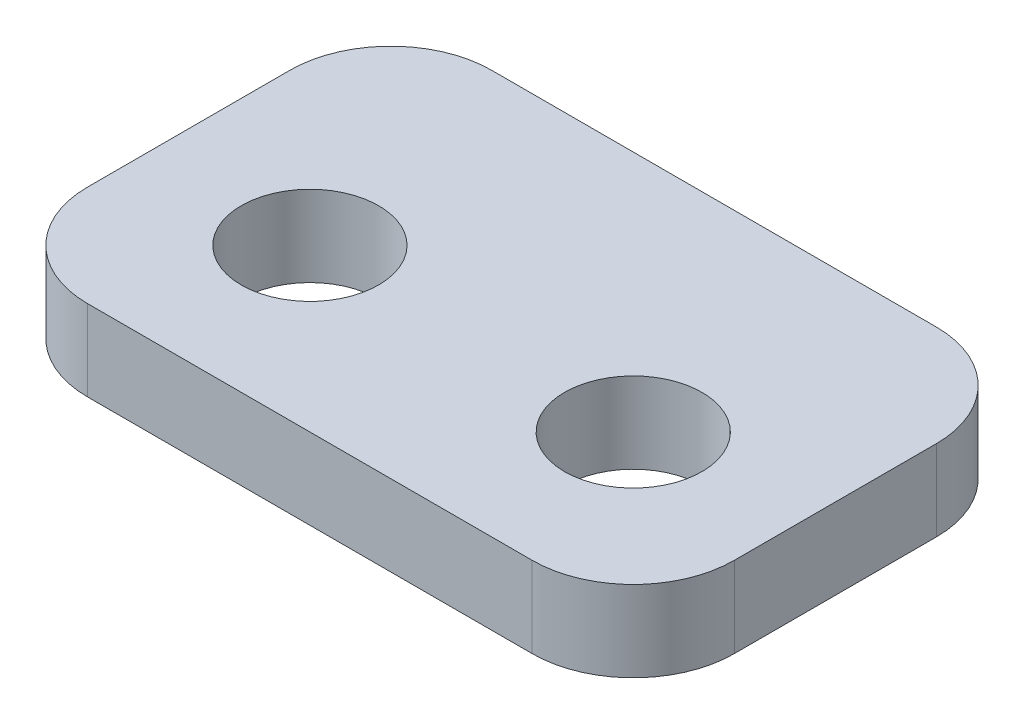
ISO-10303-21;
HEADER;
FILE_DESCRIPTION(('STEP AP214'),'2;1');
FILE_NAME('part.step','',(''),(''),'','','');
FILE_SCHEMA(('AUTOMOTIVE_DESIGN { 1 0 10303 214 1 1 1 1 }'));
ENDSEC;
DATA;
#1=APPLICATION_CONTEXT('core data for automotive mechanical design processes');
#2=APPLICATION_PROTOCOL_DEFINITION('international standard','automotive_design',2000,#1);
#3=PRODUCT_CONTEXT('',#1,'mechanical');
#4=PRODUCT('Part','Part','',(#3));
#5=PRODUCT_RELATED_PRODUCT_CATEGORY('part','',(#4));
#6=PRODUCT_DEFINITION_FORMATION('','',#4);
#7=PRODUCT_DEFINITION_CONTEXT('part definition',#1,'design');
#8=PRODUCT_DEFINITION('design','',#6,#7);
#9=PRODUCT_DEFINITION_SHAPE('','',#8);
#10=(LENGTH_UNIT() NAMED_UNIT(*) SI_UNIT(.MILLI.,.METRE.));
#11=(NAMED_UNIT(*) PLANE_ANGLE_UNIT() SI_UNIT($,.RADIAN.));
#12=(NAMED_UNIT(*) SI_UNIT($,.STERADIAN.) SOLID_ANGLE_UNIT());
#13=UNCERTAINTY_MEASURE_WITH_UNIT(LENGTH_MEASURE(1.E-05),#10,'distance_accuracy_value','');
#14=(GEOMETRIC_REPRESENTATION_CONTEXT(3) GLOBAL_UNCERTAINTY_ASSIGNED_CONTEXT((#13)) GLOBAL_UNIT_ASSIGNED_CONTEXT((#10,
#11,#12)) REPRESENTATION_CONTEXT('',''));
#15=CARTESIAN_POINT('',(0.,0.,0.));
#16=DIRECTION('',(0.,0.,1.));
#17=DIRECTION('',(1.,0.,0.));
#18=AXIS2_PLACEMENT_3D('',#15,#16,#17);
#19=CARTESIAN_POINT('',(0.,2.,0.));
#20=DIRECTION('',(0.,-1.,0.));
#21=DIRECTION('',(0.,0.,-1.));
#22=AXIS2_PLACEMENT_3D('',#19,#20,#21);
#23=PLANE('',#22);
#24=DIRECTION('',(0.,0.,1.));
#25=VECTOR('',#24,1.);
#26=CARTESIAN_POINT('',(-8.,2.,4.));
#27=LINE('',#26,#25);
#28=CARTESIAN_POINT('',(-8.,2.,-3.5));
#29=VERTEX_POINT('',#28);
#30=CARTESIAN_POINT('',(-8.,2.,1.5));
#31=VERTEX_POINT('',#30);
#32=EDGE_CURVE('E206',#29,#31,#27,.T.);
#33=ORIENTED_EDGE('',*,*,#32,.T.);
#34=CARTESIAN_POINT('',(-5.5,2.,1.5));
#35=DIRECTION('',(0.,-1.,0.));
#36=DIRECTION('',(0.,0.,-1.));
#37=AXIS2_PLACEMENT_3D('',#34,#35,#36);
#38=CIRCLE('',#37,2.5);
#39=CARTESIAN_POINT('',(-5.5,2.,4.));
#40=VERTEX_POINT('',#39);
#41=EDGE_CURVE('E175',#31,#40,#38,.F.);
#42=ORIENTED_EDGE('',*,*,#41,.T.);
#43=DIRECTION('',(1.,0.,0.));
#44=VECTOR('',#43,1.);
#45=CARTESIAN_POINT('',(-8.,2.,4.));
#46=LINE('',#45,#44);
#47=CARTESIAN_POINT('',(5.5,2.,4.));
#48=VERTEX_POINT('',#47);
#49=EDGE_CURVE('E133',#40,#48,#46,.T.);
#50=ORIENTED_EDGE('',*,*,#49,.T.);
#51=CARTESIAN_POINT('',(5.5,2.,1.5));
#52=DIRECTION('',(0.,-1.,0.));
#53=DIRECTION('',(0.,0.,-1.));
#54=AXIS2_PLACEMENT_3D('',#51,#52,#53);
#55=CIRCLE('',#54,2.5);
#56=CARTESIAN_POINT('',(8.,2.,1.5));
#57=VERTEX_POINT('',#56);
#58=EDGE_CURVE('E167',#48,#57,#55,.F.);
#59=ORIENTED_EDGE('',*,*,#58,.T.);
#60=DIRECTION('',(0.,0.,-1.));
#61=VECTOR('',#60,1.);
#62=CARTESIAN_POINT('',(8.,2.,4.));
#63=LINE('',#62,#61);
#64=CARTESIAN_POINT('',(8.,2.,-3.5));
#65=VERTEX_POINT('',#64);
#66=EDGE_CURVE('E142',#57,#65,#63,.T.);
#67=ORIENTED_EDGE('',*,*,#66,.T.);
#68=CARTESIAN_POINT('',(5.5,2.,-3.5));
#69=DIRECTION('',(0.,-1.,0.));
#70=DIRECTION('',(0.,0.,-1.));
#71=AXIS2_PLACEMENT_3D('',#68,#69,#70);
#72=CIRCLE('',#71,2.5);
#73=CARTESIAN_POINT('',(5.5,2.,-6.));
#74=VERTEX_POINT('',#73);
#75=EDGE_CURVE('E68',#65,#74,#72,.F.);
#76=ORIENTED_EDGE('',*,*,#75,.T.);
#77=DIRECTION('',(-1.,0.,0.));
#78=VECTOR('',#77,1.);
#79=CARTESIAN_POINT('',(-8.,2.,-6.));
#80=LINE('',#79,#78);
#81=CARTESIAN_POINT('',(-5.5,2.,-6.));
#82=VERTEX_POINT('',#81);
#83=EDGE_CURVE('E147',#74,#82,#80,.T.);
#84=ORIENTED_EDGE('',*,*,#83,.T.);
#85=CARTESIAN_POINT('',(-5.5,2.,-3.5));
#86=DIRECTION('',(0.,-1.,0.));
#87=DIRECTION('',(0.,0.,-1.));
#88=AXIS2_PLACEMENT_3D('',#85,#86,#87);
#89=CIRCLE('',#88,2.5);
#90=EDGE_CURVE('E172',#82,#29,#89,.F.);
#91=ORIENTED_EDGE('',*,*,#90,.T.);
#92=EDGE_LOOP('',(#33,#42,#50,#59,#67,#76,#84,#91));
#93=FACE_BOUND('',#92,.T.);
#94=CARTESIAN_POINT('',(-4.,2.,0.));
#95=DIRECTION('',(0.,1.,0.));
#96=DIRECTION('',(0.,0.,1.));
#97=AXIS2_PLACEMENT_3D('',#94,#95,#96);
#98=CIRCLE('',#97,1.7);
#99=CARTESIAN_POINT('',(-4.,2.,1.7));
#100=VERTEX_POINT('',#99);
#101=EDGE_CURVE('E196',#100,#100,#98,.T.);
#102=ORIENTED_EDGE('',*,*,#101,.F.);
#103=EDGE_LOOP('',(#102));
#104=FACE_BOUND('',#103,.T.);
#105=CARTESIAN_POINT('',(4.,2.,0.));
#106=DIRECTION('',(0.,1.,0.));
#107=DIRECTION('',(0.,0.,1.));
#108=AXIS2_PLACEMENT_3D('',#105,#106,#107);
#109=CIRCLE('',#108,1.7);
#110=CARTESIAN_POINT('',(4.,2.,1.7));
#111=VERTEX_POINT('',#110);
#112=EDGE_CURVE('E214',#111,#111,#109,.T.);
#113=ORIENTED_EDGE('',*,*,#112,.F.);
#114=EDGE_LOOP('',(#113));
#115=FACE_BOUND('',#114,.T.);
#116=ADVANCED_FACE('F45',(#93,#104,#115),#23,.F.);
#117=CARTESIAN_POINT('',(0.,0.,0.));
#118=DIRECTION('',(0.,-1.,0.));
#119=DIRECTION('',(0.,0.,-1.));
#120=AXIS2_PLACEMENT_3D('',#117,#118,#119);
#121=PLANE('',#120);
#122=CARTESIAN_POINT('',(-4.,0.,0.));
#123=DIRECTION('',(0.,1.,0.));
#124=DIRECTION('',(0.,0.,1.));
#125=AXIS2_PLACEMENT_3D('',#122,#123,#124);
#126=CIRCLE('',#125,1.7);
#127=CARTESIAN_POINT('',(-4.,0.,1.7));
#128=VERTEX_POINT('',#127);
#129=EDGE_CURVE('E201',#128,#128,#126,.T.);
#130=ORIENTED_EDGE('',*,*,#129,.T.);
#131=EDGE_LOOP('',(#130));
#132=FACE_BOUND('',#131,.T.);
#133=DIRECTION('',(1.,0.,0.));
#134=VECTOR('',#133,1.);
#135=CARTESIAN_POINT('',(-8.,0.,4.));
#136=LINE('',#135,#134);
#137=CARTESIAN_POINT('',(-5.5,0.,4.));
#138=VERTEX_POINT('',#137);
#139=CARTESIAN_POINT('',(5.5,0.,4.));
#140=VERTEX_POINT('',#139);
#141=EDGE_CURVE('E130',#138,#140,#136,.T.);
#142=ORIENTED_EDGE('',*,*,#141,.F.);
#143=CARTESIAN_POINT('',(-5.5,0.,1.5));
#144=DIRECTION('',(0.,-1.,0.));
#145=DIRECTION('',(0.,0.,-1.));
#146=AXIS2_PLACEMENT_3D('',#143,#144,#145);
#147=CIRCLE('',#146,2.5);
#148=CARTESIAN_POINT('',(-8.,0.,1.5));
#149=VERTEX_POINT('',#148);
#150=EDGE_CURVE('E112',#138,#149,#147,.T.);
#151=ORIENTED_EDGE('',*,*,#150,.T.);
#152=DIRECTION('',(0.,0.,1.));
#153=VECTOR('',#152,1.);
#154=CARTESIAN_POINT('',(-8.,0.,4.));
#155=LINE('',#154,#153);
#156=CARTESIAN_POINT('',(-8.,0.,-3.5));
#157=VERTEX_POINT('',#156);
#158=EDGE_CURVE('E143',#157,#149,#155,.T.);
#159=ORIENTED_EDGE('',*,*,#158,.F.);
#160=CARTESIAN_POINT('',(-5.5,0.,-3.5));
#161=DIRECTION('',(0.,-1.,0.));
#162=DIRECTION('',(0.,0.,-1.));
#163=AXIS2_PLACEMENT_3D('',#160,#161,#162);
#164=CIRCLE('',#163,2.5);
#165=CARTESIAN_POINT('',(-5.5,0.,-6.));
#166=VERTEX_POINT('',#165);
#167=EDGE_CURVE('E124',#157,#166,#164,.T.);
#168=ORIENTED_EDGE('',*,*,#167,.T.);
#169=DIRECTION('',(-1.,0.,0.));
#170=VECTOR('',#169,1.);
#171=CARTESIAN_POINT('',(-8.,0.,-6.));
#172=LINE('',#171,#170);
#173=CARTESIAN_POINT('',(5.5,0.,-6.));
#174=VERTEX_POINT('',#173);
#175=EDGE_CURVE('E149',#174,#166,#172,.T.);
#176=ORIENTED_EDGE('',*,*,#175,.F.);
#177=CARTESIAN_POINT('',(5.5,0.,-3.5));
#178=DIRECTION('',(0.,-1.,0.));
#179=DIRECTION('',(0.,0.,-1.));
#180=AXIS2_PLACEMENT_3D('',#177,#178,#179);
#181=CIRCLE('',#180,2.5);
#182=CARTESIAN_POINT('',(8.,0.,-3.5));
#183=VERTEX_POINT('',#182);
#184=EDGE_CURVE('E157',#174,#183,#181,.T.);
#185=ORIENTED_EDGE('',*,*,#184,.T.);
#186=DIRECTION('',(0.,0.,-1.));
#187=VECTOR('',#186,1.);
#188=CARTESIAN_POINT('',(8.,0.,4.));
#189=LINE('',#188,#187);
#190=CARTESIAN_POINT('',(8.,0.,1.5));
#191=VERTEX_POINT('',#190);
#192=EDGE_CURVE('E190',#191,#183,#189,.T.);
#193=ORIENTED_EDGE('',*,*,#192,.F.);
#194=CARTESIAN_POINT('',(5.5,0.,1.5));
#195=DIRECTION('',(0.,-1.,0.));
#196=DIRECTION('',(0.,0.,-1.));
#197=AXIS2_PLACEMENT_3D('',#194,#195,#196);
#198=CIRCLE('',#197,2.5);
#199=EDGE_CURVE('E135',#191,#140,#198,.T.);
#200=ORIENTED_EDGE('',*,*,#199,.T.);
#201=EDGE_LOOP('',(#142,#151,#159,#168,#176,#185,#193,#200));
#202=FACE_BOUND('',#201,.T.);
#203=CARTESIAN_POINT('',(4.,0.,0.));
#204=DIRECTION('',(0.,1.,0.));
#205=DIRECTION('',(0.,0.,1.));
#206=AXIS2_PLACEMENT_3D('',#203,#204,#205);
#207=CIRCLE('',#206,1.7);
#208=CARTESIAN_POINT('',(4.,0.,1.7));
#209=VERTEX_POINT('',#208);
#210=EDGE_CURVE('E216',#209,#209,#207,.T.);
#211=ORIENTED_EDGE('',*,*,#210,.T.);
#212=EDGE_LOOP('',(#211));
#213=FACE_BOUND('',#212,.T.);
#214=ADVANCED_FACE('F138',(#132,#202,#213),#121,.T.);
#215=CARTESIAN_POINT('',(8.,2.,4.));
#216=DIRECTION('',(-1.,0.,0.));
#217=DIRECTION('',(0.,0.,1.));
#218=AXIS2_PLACEMENT_3D('',#215,#216,#217);
#219=PLANE('',#218);
#220=ORIENTED_EDGE('',*,*,#192,.T.);
#221=DIRECTION('',(0.,-1.,0.));
#222=VECTOR('',#221,1.);
#223=CARTESIAN_POINT('',(8.,2.,-3.5));
#224=LINE('',#223,#222);
#225=EDGE_CURVE('E11',#183,#65,#224,.F.);
#226=ORIENTED_EDGE('',*,*,#225,.T.);
#227=ORIENTED_EDGE('',*,*,#66,.F.);
#228=DIRECTION('',(0.,-1.,0.));
#229=VECTOR('',#228,1.);
#230=CARTESIAN_POINT('',(8.,2.,1.5));
#231=LINE('',#230,#229);
#232=EDGE_CURVE('E54',#57,#191,#231,.T.);
#233=ORIENTED_EDGE('',*,*,#232,.T.);
#234=EDGE_LOOP('',(#220,#226,#227,#233));
#235=FACE_BOUND('',#234,.T.);
#236=ADVANCED_FACE('F189',(#235),#219,.F.);
#237=CARTESIAN_POINT('',(-8.,2.,-6.));
#238=DIRECTION('',(0.,0.,1.));
#239=DIRECTION('',(1.,0.,0.));
#240=AXIS2_PLACEMENT_3D('',#237,#238,#239);
#241=PLANE('',#240);
#242=ORIENTED_EDGE('',*,*,#175,.T.);
#243=DIRECTION('',(0.,-1.,0.));
#244=VECTOR('',#243,1.);
#245=CARTESIAN_POINT('',(-5.5,2.,-6.));
#246=LINE('',#245,#244);
#247=EDGE_CURVE('E61',#166,#82,#246,.F.);
#248=ORIENTED_EDGE('',*,*,#247,.T.);
#249=ORIENTED_EDGE('',*,*,#83,.F.);
#250=DIRECTION('',(0.,-1.,0.));
#251=VECTOR('',#250,1.);
#252=CARTESIAN_POINT('',(5.5,2.,-6.));
#253=LINE('',#252,#251);
#254=EDGE_CURVE('E178',#74,#174,#253,.T.);
#255=ORIENTED_EDGE('',*,*,#254,.T.);
#256=EDGE_LOOP('',(#242,#248,#249,#255));
#257=FACE_BOUND('',#256,.T.);
#258=ADVANCED_FACE('F244',(#257),#241,.F.);
#259=CARTESIAN_POINT('',(-8.,2.,4.));
#260=DIRECTION('',(1.,0.,0.));
#261=DIRECTION('',(0.,0.,-1.));
#262=AXIS2_PLACEMENT_3D('',#259,#260,#261);
#263=PLANE('',#262);
#264=ORIENTED_EDGE('',*,*,#158,.T.);
#265=DIRECTION('',(0.,-1.,0.));
#266=VECTOR('',#265,1.);
#267=CARTESIAN_POINT('',(-8.,2.,1.5));
#268=LINE('',#267,#266);
#269=EDGE_CURVE('E117',#149,#31,#268,.F.);
#270=ORIENTED_EDGE('',*,*,#269,.T.);
#271=ORIENTED_EDGE('',*,*,#32,.F.);
#272=DIRECTION('',(0.,-1.,0.));
#273=VECTOR('',#272,1.);
#274=CARTESIAN_POINT('',(-8.,2.,-3.5));
#275=LINE('',#274,#273);
#276=EDGE_CURVE('E123',#29,#157,#275,.T.);
#277=ORIENTED_EDGE('',*,*,#276,.T.);
#278=EDGE_LOOP('',(#264,#270,#271,#277));
#279=FACE_BOUND('',#278,.T.);
#280=ADVANCED_FACE('F241',(#279),#263,.F.);
#281=CARTESIAN_POINT('',(-8.,2.,4.));
#282=DIRECTION('',(0.,0.,-1.));
#283=DIRECTION('',(-1.,0.,0.));
#284=AXIS2_PLACEMENT_3D('',#281,#282,#283);
#285=PLANE('',#284);
#286=ORIENTED_EDGE('',*,*,#49,.F.);
#287=DIRECTION('',(0.,-1.,0.));
#288=VECTOR('',#287,1.);
#289=CARTESIAN_POINT('',(-5.5,2.,4.));
#290=LINE('',#289,#288);
#291=EDGE_CURVE('E116',#40,#138,#290,.T.);
#292=ORIENTED_EDGE('',*,*,#291,.T.);
#293=ORIENTED_EDGE('',*,*,#141,.T.);
#294=DIRECTION('',(0.,-1.,0.));
#295=VECTOR('',#294,1.);
#296=CARTESIAN_POINT('',(5.5,2.,4.));
#297=LINE('',#296,#295);
#298=EDGE_CURVE('E136',#140,#48,#297,.F.);
#299=ORIENTED_EDGE('',*,*,#298,.T.);
#300=EDGE_LOOP('',(#286,#292,#293,#299));
#301=FACE_BOUND('',#300,.T.);
#302=ADVANCED_FACE('F129',(#301),#285,.F.);
#303=CARTESIAN_POINT('',(-4.,2.,0.));
#304=DIRECTION('',(0.,-1.,0.));
#305=DIRECTION('',(0.,0.,-1.));
#306=AXIS2_PLACEMENT_3D('',#303,#304,#305);
#307=CYLINDRICAL_SURFACE('',#306,1.7);
#308=ORIENTED_EDGE('',*,*,#101,.T.);
#309=EDGE_LOOP('',(#308));
#310=FACE_BOUND('',#309,.T.);
#311=ORIENTED_EDGE('',*,*,#129,.F.);
#312=EDGE_LOOP('',(#311));
#313=FACE_BOUND('',#312,.T.);
#314=ADVANCED_FACE('F236',(#310,#313),#307,.F.);
#315=CARTESIAN_POINT('',(4.,2.,0.));
#316=DIRECTION('',(0.,-1.,0.));
#317=DIRECTION('',(0.,0.,-1.));
#318=AXIS2_PLACEMENT_3D('',#315,#316,#317);
#319=CYLINDRICAL_SURFACE('',#318,1.7);
#320=ORIENTED_EDGE('',*,*,#112,.T.);
#321=EDGE_LOOP('',(#320));
#322=FACE_BOUND('',#321,.T.);
#323=ORIENTED_EDGE('',*,*,#210,.F.);
#324=EDGE_LOOP('',(#323));
#325=FACE_BOUND('',#324,.T.);
#326=ADVANCED_FACE('F224',(#322,#325),#319,.F.);
#327=CARTESIAN_POINT('',(-5.5,2.,1.5));
#328=DIRECTION('',(0.,-1.,0.));
#329=DIRECTION('',(0.,0.,-1.));
#330=AXIS2_PLACEMENT_3D('',#327,#328,#329);
#331=CYLINDRICAL_SURFACE('',#330,2.5);
#332=ORIENTED_EDGE('',*,*,#41,.F.);
#333=ORIENTED_EDGE('',*,*,#269,.F.);
#334=ORIENTED_EDGE('',*,*,#150,.F.);
#335=ORIENTED_EDGE('',*,*,#291,.F.);
#336=EDGE_LOOP('',(#332,#333,#334,#335));
#337=FACE_BOUND('',#336,.T.);
#338=ADVANCED_FACE('F115',(#337),#331,.T.);
#339=CARTESIAN_POINT('',(-5.5,2.,-3.5));
#340=DIRECTION('',(0.,-1.,0.));
#341=DIRECTION('',(0.,0.,-1.));
#342=AXIS2_PLACEMENT_3D('',#339,#340,#341);
#343=CYLINDRICAL_SURFACE('',#342,2.5);
#344=ORIENTED_EDGE('',*,*,#90,.F.);
#345=ORIENTED_EDGE('',*,*,#247,.F.);
#346=ORIENTED_EDGE('',*,*,#167,.F.);
#347=ORIENTED_EDGE('',*,*,#276,.F.);
#348=EDGE_LOOP('',(#344,#345,#346,#347));
#349=FACE_BOUND('',#348,.T.);
#350=ADVANCED_FACE('F252',(#349),#343,.T.);
#351=CARTESIAN_POINT('',(5.5,2.,-3.5));
#352=DIRECTION('',(0.,-1.,0.));
#353=DIRECTION('',(0.,0.,-1.));
#354=AXIS2_PLACEMENT_3D('',#351,#352,#353);
#355=CYLINDRICAL_SURFACE('',#354,2.5);
#356=ORIENTED_EDGE('',*,*,#75,.F.);
#357=ORIENTED_EDGE('',*,*,#225,.F.);
#358=ORIENTED_EDGE('',*,*,#184,.F.);
#359=ORIENTED_EDGE('',*,*,#254,.F.);
#360=EDGE_LOOP('',(#356,#357,#358,#359));
#361=FACE_BOUND('',#360,.T.);
#362=ADVANCED_FACE('F254',(#361),#355,.T.);
#363=CARTESIAN_POINT('',(5.5,2.,1.5));
#364=DIRECTION('',(0.,-1.,0.));
#365=DIRECTION('',(0.,0.,-1.));
#366=AXIS2_PLACEMENT_3D('',#363,#364,#365);
#367=CYLINDRICAL_SURFACE('',#366,2.5);
#368=ORIENTED_EDGE('',*,*,#58,.F.);
#369=ORIENTED_EDGE('',*,*,#298,.F.);
#370=ORIENTED_EDGE('',*,*,#199,.F.);
#371=ORIENTED_EDGE('',*,*,#232,.F.);
#372=EDGE_LOOP('',(#368,#369,#370,#371));
#373=FACE_BOUND('',#372,.T.);
#374=ADVANCED_FACE('F47',(#373),#367,.T.);
#375=CLOSED_SHELL('',(#116,#214,#236,#258,#280,#302,#314,#326,#338,#350,#362,#374));
#376=MANIFOLD_SOLID_BREP('B2',#375);
#377=ADVANCED_BREP_SHAPE_REPRESENTATION('',(#18,#376),#14);
#378=SHAPE_DEFINITION_REPRESENTATION(#9,#377);
ENDSEC;
END-ISO-10303-21;
